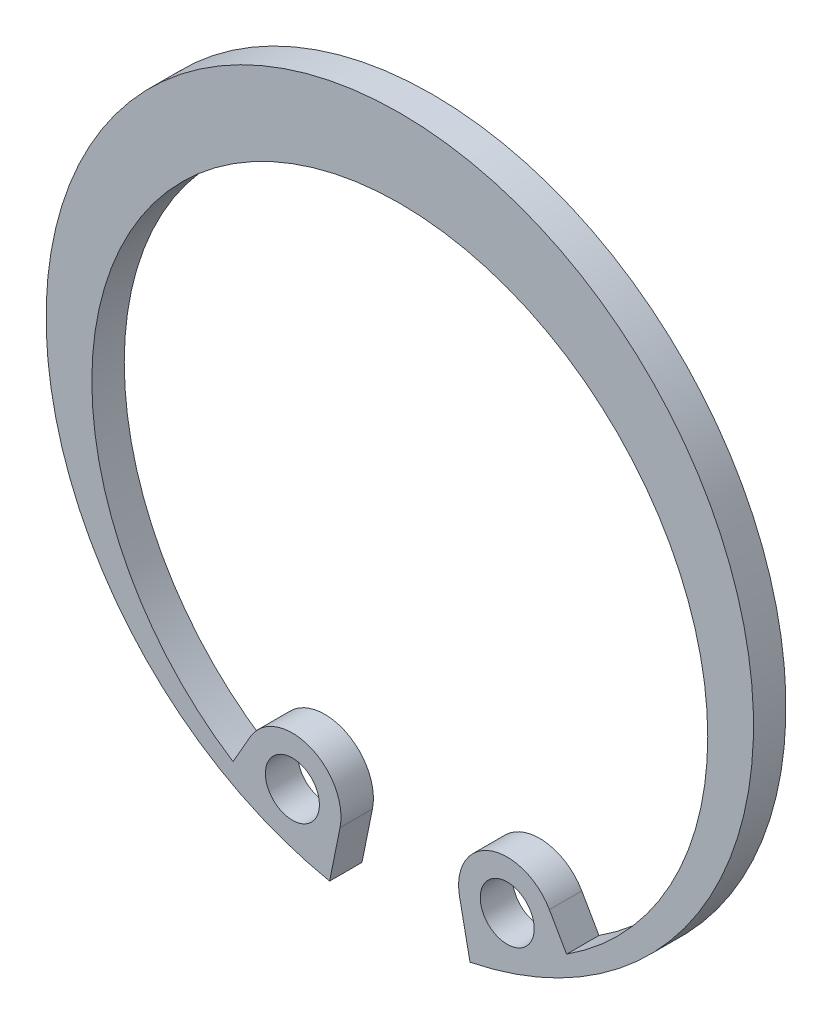
ISO-10303-21;
HEADER;
FILE_DESCRIPTION(('STEP AP214'),'2;1');
FILE_NAME('part.step','',(''),(''),'','','');
FILE_SCHEMA(('AUTOMOTIVE_DESIGN { 1 0 10303 214 1 1 1 1 }'));
ENDSEC;
DATA;
#1=APPLICATION_CONTEXT('core data for automotive mechanical design processes');
#2=APPLICATION_PROTOCOL_DEFINITION('international standard','automotive_design',2000,#1);
#3=PRODUCT_CONTEXT('',#1,'mechanical');
#4=PRODUCT('Part','Part','',(#3));
#5=PRODUCT_RELATED_PRODUCT_CATEGORY('part','',(#4));
#6=PRODUCT_DEFINITION_FORMATION('','',#4);
#7=PRODUCT_DEFINITION_CONTEXT('part definition',#1,'design');
#8=PRODUCT_DEFINITION('design','',#6,#7);
#9=PRODUCT_DEFINITION_SHAPE('','',#8);
#10=(LENGTH_UNIT() NAMED_UNIT(*) SI_UNIT(.MILLI.,.METRE.));
#11=(NAMED_UNIT(*) PLANE_ANGLE_UNIT() SI_UNIT($,.RADIAN.));
#12=(NAMED_UNIT(*) SI_UNIT($,.STERADIAN.) SOLID_ANGLE_UNIT());
#13=UNCERTAINTY_MEASURE_WITH_UNIT(LENGTH_MEASURE(1.E-05),#10,'distance_accuracy_value','');
#14=(GEOMETRIC_REPRESENTATION_CONTEXT(3) GLOBAL_UNCERTAINTY_ASSIGNED_CONTEXT((#13)) GLOBAL_UNIT_ASSIGNED_CONTEXT((#10,
#11,#12)) REPRESENTATION_CONTEXT('',''));
#15=CARTESIAN_POINT('',(0.,0.,0.));
#16=DIRECTION('',(0.,0.,1.));
#17=DIRECTION('',(1.,0.,0.));
#18=AXIS2_PLACEMENT_3D('',#15,#16,#17);
#19=CARTESIAN_POINT('',(0.,-1.20555555555556,1.2));
#20=DIRECTION('',(0.,0.,1.));
#21=DIRECTION('',(1.,0.,0.));
#22=AXIS2_PLACEMENT_3D('',#19,#20,#21);
#23=PLANE('',#22);
#24=CARTESIAN_POINT('',(-3.97830291432374,-10.5765356294906,1.2));
#25=DIRECTION('',(0.,0.,-1.));
#26=DIRECTION('',(-1.,0.,0.));
#27=AXIS2_PLACEMENT_3D('',#24,#25,#26);
#28=CIRCLE('',#27,1.);
#29=CARTESIAN_POINT('',(-4.97830291432374,-10.5765356294906,1.2));
#30=VERTEX_POINT('',#29);
#31=EDGE_CURVE('E259',#30,#30,#28,.T.);
#32=ORIENTED_EDGE('',*,*,#31,.T.);
#33=EDGE_LOOP('',(#32));
#34=FACE_BOUND('',#33,.T.);
#35=CARTESIAN_POINT('',(0.,-1.20555555555556,1.2));
#36=DIRECTION('',(0.,0.,1.));
#37=DIRECTION('',(1.,0.,0.));
#38=AXIS2_PLACEMENT_3D('',#35,#36,#37);
#39=CIRCLE('',#38,11.4055555555556);
#40=CARTESIAN_POINT('',(6.1765617534573,-10.7939225925746,1.2));
#41=VERTEX_POINT('',#40);
#42=CARTESIAN_POINT('',(-6.1765617534573,-10.7939225925746,1.2));
#43=VERTEX_POINT('',#42);
#44=EDGE_CURVE('E93',#41,#43,#39,.T.);
#45=ORIENTED_EDGE('',*,*,#44,.F.);
#46=DIRECTION('',(-0.496660519236277,0.867944888015335,0.));
#47=VECTOR('',#46,1.);
#48=CARTESIAN_POINT('',(6.1765617534573,-10.7939225925746,1.2));
#49=LINE('',#48,#47);
#50=CARTESIAN_POINT('',(5.54060371275134,-9.68254669486525,1.2));
#51=VERTEX_POINT('',#50);
#52=EDGE_CURVE('E48',#41,#51,#49,.T.);
#53=ORIENTED_EDGE('',*,*,#52,.T.);
#54=CARTESIAN_POINT('',(3.97830291432374,-10.5765356294906,1.2));
#55=DIRECTION('',(0.,0.,-1.));
#56=DIRECTION('',(-1.,0.,0.));
#57=AXIS2_PLACEMENT_3D('',#54,#55,#56);
#58=CIRCLE('',#57,1.8);
#59=CARTESIAN_POINT('',(2.21411157721012,-10.9337875378875,1.2));
#60=VERTEX_POINT('',#59);
#61=EDGE_CURVE('E144',#60,#51,#58,.T.);
#62=ORIENTED_EDGE('',*,*,#61,.F.);
#63=DIRECTION('',(0.198473282442748,-0.980106298396455,0.));
#64=VECTOR('',#63,1.);
#65=CARTESIAN_POINT('',(2.21411157721012,-10.9337875378875,1.2));
#66=LINE('',#65,#64);
#67=CARTESIAN_POINT('',(2.6,-12.8393925089936,1.2));
#68=VERTEX_POINT('',#67);
#69=EDGE_CURVE('E142',#60,#68,#66,.T.);
#70=ORIENTED_EDGE('',*,*,#69,.T.);
#71=CARTESIAN_POINT('',(0.,0.,1.2));
#72=DIRECTION('',(0.,0.,1.));
#73=DIRECTION('',(1.,0.,0.));
#74=AXIS2_PLACEMENT_3D('',#71,#72,#73);
#75=CIRCLE('',#74,13.1);
#76=CARTESIAN_POINT('',(-2.60000000000001,-12.8393925089936,1.2));
#77=VERTEX_POINT('',#76);
#78=EDGE_CURVE('E140',#68,#77,#75,.T.);
#79=ORIENTED_EDGE('',*,*,#78,.T.);
#80=DIRECTION('',(-0.198473282442748,-0.980106298396455,0.));
#81=VECTOR('',#80,1.);
#82=CARTESIAN_POINT('',(-2.21411157721012,-10.9337875378875,1.2));
#83=LINE('',#82,#81);
#84=CARTESIAN_POINT('',(-2.21411157721012,-10.9337875378875,1.2));
#85=VERTEX_POINT('',#84);
#86=EDGE_CURVE('E137',#85,#77,#83,.T.);
#87=ORIENTED_EDGE('',*,*,#86,.F.);
#88=CARTESIAN_POINT('',(-3.97830291432374,-10.5765356294906,1.2));
#89=DIRECTION('',(0.,0.,1.));
#90=DIRECTION('',(1.,0.,0.));
#91=AXIS2_PLACEMENT_3D('',#88,#89,#90);
#92=CIRCLE('',#91,1.8);
#93=CARTESIAN_POINT('',(-5.54060371275134,-9.68254669486526,1.2));
#94=VERTEX_POINT('',#93);
#95=EDGE_CURVE('E135',#85,#94,#92,.T.);
#96=ORIENTED_EDGE('',*,*,#95,.T.);
#97=DIRECTION('',(0.496660519236278,0.867944888015334,0.));
#98=VECTOR('',#97,1.);
#99=CARTESIAN_POINT('',(-6.1765617534573,-10.7939225925746,1.2));
#100=LINE('',#99,#98);
#101=EDGE_CURVE('E133',#43,#94,#100,.T.);
#102=ORIENTED_EDGE('',*,*,#101,.F.);
#103=EDGE_LOOP('',(#45,#53,#62,#70,#79,#87,#96,#102));
#104=FACE_BOUND('',#103,.T.);
#105=CARTESIAN_POINT('',(3.97830291432374,-10.5765356294906,1.2));
#106=DIRECTION('',(0.,0.,1.));
#107=DIRECTION('',(1.,0.,0.));
#108=AXIS2_PLACEMENT_3D('',#105,#106,#107);
#109=CIRCLE('',#108,1.);
#110=CARTESIAN_POINT('',(4.97830291432374,-10.5765356294906,1.2));
#111=VERTEX_POINT('',#110);
#112=EDGE_CURVE('E113',#111,#111,#109,.T.);
#113=ORIENTED_EDGE('',*,*,#112,.F.);
#114=EDGE_LOOP('',(#113));
#115=FACE_BOUND('',#114,.T.);
#116=ADVANCED_FACE('F26',(#34,#104,#115),#23,.T.);
#117=CARTESIAN_POINT('',(0.,-1.20555555555556,0.));
#118=DIRECTION('',(0.,0.,1.));
#119=DIRECTION('',(1.,0.,0.));
#120=AXIS2_PLACEMENT_3D('',#117,#118,#119);
#121=PLANE('',#120);
#122=CARTESIAN_POINT('',(-3.97830291432374,-10.5765356294906,0.));
#123=DIRECTION('',(0.,0.,-1.));
#124=DIRECTION('',(-1.,0.,0.));
#125=AXIS2_PLACEMENT_3D('',#122,#123,#124);
#126=CIRCLE('',#125,1.);
#127=CARTESIAN_POINT('',(-4.97830291432374,-10.5765356294906,0.));
#128=VERTEX_POINT('',#127);
#129=EDGE_CURVE('E262',#128,#128,#126,.T.);
#130=ORIENTED_EDGE('',*,*,#129,.F.);
#131=EDGE_LOOP('',(#130));
#132=FACE_BOUND('',#131,.T.);
#133=CARTESIAN_POINT('',(0.,-1.20555555555556,0.));
#134=DIRECTION('',(0.,0.,1.));
#135=DIRECTION('',(1.,0.,0.));
#136=AXIS2_PLACEMENT_3D('',#133,#134,#135);
#137=CIRCLE('',#136,11.4055555555556);
#138=CARTESIAN_POINT('',(6.1765617534573,-10.7939225925746,0.));
#139=VERTEX_POINT('',#138);
#140=CARTESIAN_POINT('',(-6.1765617534573,-10.7939225925746,0.));
#141=VERTEX_POINT('',#140);
#142=EDGE_CURVE('E92',#139,#141,#137,.T.);
#143=ORIENTED_EDGE('',*,*,#142,.T.);
#144=DIRECTION('',(0.496660519236278,0.867944888015334,0.));
#145=VECTOR('',#144,1.);
#146=CARTESIAN_POINT('',(-6.1765617534573,-10.7939225925746,0.));
#147=LINE('',#146,#145);
#148=CARTESIAN_POINT('',(-5.54060371275134,-9.68254669486526,0.));
#149=VERTEX_POINT('',#148);
#150=EDGE_CURVE('E99',#141,#149,#147,.T.);
#151=ORIENTED_EDGE('',*,*,#150,.T.);
#152=CARTESIAN_POINT('',(-3.97830291432374,-10.5765356294906,0.));
#153=DIRECTION('',(0.,0.,1.));
#154=DIRECTION('',(1.,0.,0.));
#155=AXIS2_PLACEMENT_3D('',#152,#153,#154);
#156=CIRCLE('',#155,1.8);
#157=CARTESIAN_POINT('',(-2.21411157721012,-10.9337875378875,0.));
#158=VERTEX_POINT('',#157);
#159=EDGE_CURVE('E105',#158,#149,#156,.T.);
#160=ORIENTED_EDGE('',*,*,#159,.F.);
#161=DIRECTION('',(-0.198473282442748,-0.980106298396455,0.));
#162=VECTOR('',#161,1.);
#163=CARTESIAN_POINT('',(-2.21411157721012,-10.9337875378875,0.));
#164=LINE('',#163,#162);
#165=CARTESIAN_POINT('',(-2.60000000000001,-12.8393925089936,0.));
#166=VERTEX_POINT('',#165);
#167=EDGE_CURVE('E121',#158,#166,#164,.T.);
#168=ORIENTED_EDGE('',*,*,#167,.T.);
#169=CARTESIAN_POINT('',(0.,0.,0.));
#170=DIRECTION('',(0.,0.,1.));
#171=DIRECTION('',(1.,0.,0.));
#172=AXIS2_PLACEMENT_3D('',#169,#170,#171);
#173=CIRCLE('',#172,13.1);
#174=CARTESIAN_POINT('',(2.6,-12.8393925089936,0.));
#175=VERTEX_POINT('',#174);
#176=EDGE_CURVE('E124',#175,#166,#173,.T.);
#177=ORIENTED_EDGE('',*,*,#176,.F.);
#178=DIRECTION('',(0.198473282442748,-0.980106298396455,0.));
#179=VECTOR('',#178,1.);
#180=CARTESIAN_POINT('',(2.21411157721012,-10.9337875378875,0.));
#181=LINE('',#180,#179);
#182=CARTESIAN_POINT('',(2.21411157721012,-10.9337875378875,0.));
#183=VERTEX_POINT('',#182);
#184=EDGE_CURVE('E127',#183,#175,#181,.T.);
#185=ORIENTED_EDGE('',*,*,#184,.F.);
#186=CARTESIAN_POINT('',(3.97830291432374,-10.5765356294906,0.));
#187=DIRECTION('',(0.,0.,-1.));
#188=DIRECTION('',(-1.,0.,0.));
#189=AXIS2_PLACEMENT_3D('',#186,#187,#188);
#190=CIRCLE('',#189,1.8);
#191=CARTESIAN_POINT('',(5.54060371275134,-9.68254669486525,0.));
#192=VERTEX_POINT('',#191);
#193=EDGE_CURVE('E129',#183,#192,#190,.T.);
#194=ORIENTED_EDGE('',*,*,#193,.T.);
#195=DIRECTION('',(-0.496660519236277,0.867944888015335,0.));
#196=VECTOR('',#195,1.);
#197=CARTESIAN_POINT('',(6.1765617534573,-10.7939225925746,0.));
#198=LINE('',#197,#196);
#199=EDGE_CURVE('E112',#139,#192,#198,.T.);
#200=ORIENTED_EDGE('',*,*,#199,.F.);
#201=EDGE_LOOP('',(#143,#151,#160,#168,#177,#185,#194,#200));
#202=FACE_BOUND('',#201,.T.);
#203=CARTESIAN_POINT('',(3.97830291432374,-10.5765356294906,0.));
#204=DIRECTION('',(0.,0.,1.));
#205=DIRECTION('',(1.,0.,0.));
#206=AXIS2_PLACEMENT_3D('',#203,#204,#205);
#207=CIRCLE('',#206,1.);
#208=CARTESIAN_POINT('',(4.97830291432374,-10.5765356294906,0.));
#209=VERTEX_POINT('',#208);
#210=EDGE_CURVE('E116',#209,#209,#207,.T.);
#211=ORIENTED_EDGE('',*,*,#210,.T.);
#212=EDGE_LOOP('',(#211));
#213=FACE_BOUND('',#212,.T.);
#214=ADVANCED_FACE('F108',(#132,#202,#213),#121,.F.);
#215=CARTESIAN_POINT('',(0.,-1.20555555555556,1.2));
#216=DIRECTION('',(0.,0.,-1.));
#217=DIRECTION('',(-1.,0.,0.));
#218=AXIS2_PLACEMENT_3D('',#215,#216,#217);
#219=CYLINDRICAL_SURFACE('',#218,11.4055555555556);
#220=ORIENTED_EDGE('',*,*,#142,.F.);
#221=DIRECTION('',(0.,0.,-1.));
#222=VECTOR('',#221,1.);
#223=CARTESIAN_POINT('',(6.1765617534573,-10.7939225925746,1.2));
#224=LINE('',#223,#222);
#225=EDGE_CURVE('E11',#41,#139,#224,.T.);
#226=ORIENTED_EDGE('',*,*,#225,.F.);
#227=ORIENTED_EDGE('',*,*,#44,.T.);
#228=DIRECTION('',(0.,0.,-1.));
#229=VECTOR('',#228,1.);
#230=CARTESIAN_POINT('',(-6.1765617534573,-10.7939225925746,1.2));
#231=LINE('',#230,#229);
#232=EDGE_CURVE('E30',#43,#141,#231,.T.);
#233=ORIENTED_EDGE('',*,*,#232,.T.);
#234=EDGE_LOOP('',(#220,#226,#227,#233));
#235=FACE_BOUND('',#234,.T.);
#236=ADVANCED_FACE('F28',(#235),#219,.F.);
#237=CARTESIAN_POINT('',(6.1765617534573,-10.7939225925746,1.2));
#238=DIRECTION('',(-0.867944888015335,-0.496660519236277,0.));
#239=DIRECTION('',(0.496660519236277,-0.867944888015335,0.));
#240=AXIS2_PLACEMENT_3D('',#237,#238,#239);
#241=PLANE('',#240);
#242=ORIENTED_EDGE('',*,*,#199,.T.);
#243=DIRECTION('',(0.,0.,-1.));
#244=VECTOR('',#243,1.);
#245=CARTESIAN_POINT('',(5.54060371275134,-9.68254669486525,1.2));
#246=LINE('',#245,#244);
#247=EDGE_CURVE('E35',#51,#192,#246,.T.);
#248=ORIENTED_EDGE('',*,*,#247,.F.);
#249=ORIENTED_EDGE('',*,*,#52,.F.);
#250=ORIENTED_EDGE('',*,*,#225,.T.);
#251=EDGE_LOOP('',(#242,#248,#249,#250));
#252=FACE_BOUND('',#251,.T.);
#253=ADVANCED_FACE('F177',(#252),#241,.F.);
#254=CARTESIAN_POINT('',(3.97830291432374,-10.5765356294906,1.2));
#255=DIRECTION('',(0.,0.,-1.));
#256=DIRECTION('',(-1.,0.,0.));
#257=AXIS2_PLACEMENT_3D('',#254,#255,#256);
#258=CYLINDRICAL_SURFACE('',#257,1.8);
#259=ORIENTED_EDGE('',*,*,#193,.F.);
#260=DIRECTION('',(0.,0.,-1.));
#261=VECTOR('',#260,1.);
#262=CARTESIAN_POINT('',(2.21411157721012,-10.9337875378875,1.2));
#263=LINE('',#262,#261);
#264=EDGE_CURVE('E149',#60,#183,#263,.T.);
#265=ORIENTED_EDGE('',*,*,#264,.F.);
#266=ORIENTED_EDGE('',*,*,#61,.T.);
#267=ORIENTED_EDGE('',*,*,#247,.T.);
#268=EDGE_LOOP('',(#259,#265,#266,#267));
#269=FACE_BOUND('',#268,.T.);
#270=ADVANCED_FACE('F174',(#269),#258,.T.);
#271=CARTESIAN_POINT('',(2.21411157721012,-10.9337875378875,1.2));
#272=DIRECTION('',(0.980106298396455,0.198473282442748,0.));
#273=DIRECTION('',(-0.198473282442748,0.980106298396455,0.));
#274=AXIS2_PLACEMENT_3D('',#271,#272,#273);
#275=PLANE('',#274);
#276=ORIENTED_EDGE('',*,*,#184,.T.);
#277=DIRECTION('',(0.,0.,-1.));
#278=VECTOR('',#277,1.);
#279=CARTESIAN_POINT('',(2.6,-12.8393925089936,1.2));
#280=LINE('',#279,#278);
#281=EDGE_CURVE('E151',#68,#175,#280,.T.);
#282=ORIENTED_EDGE('',*,*,#281,.F.);
#283=ORIENTED_EDGE('',*,*,#69,.F.);
#284=ORIENTED_EDGE('',*,*,#264,.T.);
#285=EDGE_LOOP('',(#276,#282,#283,#284));
#286=FACE_BOUND('',#285,.T.);
#287=ADVANCED_FACE('F179',(#286),#275,.F.);
#288=CARTESIAN_POINT('',(0.,0.,1.2));
#289=DIRECTION('',(0.,0.,-1.));
#290=DIRECTION('',(-1.,0.,0.));
#291=AXIS2_PLACEMENT_3D('',#288,#289,#290);
#292=CYLINDRICAL_SURFACE('',#291,13.1);
#293=ORIENTED_EDGE('',*,*,#176,.T.);
#294=DIRECTION('',(0.,0.,-1.));
#295=VECTOR('',#294,1.);
#296=CARTESIAN_POINT('',(-2.60000000000001,-12.8393925089936,1.2));
#297=LINE('',#296,#295);
#298=EDGE_CURVE('E154',#77,#166,#297,.T.);
#299=ORIENTED_EDGE('',*,*,#298,.F.);
#300=ORIENTED_EDGE('',*,*,#78,.F.);
#301=ORIENTED_EDGE('',*,*,#281,.T.);
#302=EDGE_LOOP('',(#293,#299,#300,#301));
#303=FACE_BOUND('',#302,.T.);
#304=ADVANCED_FACE('F168',(#303),#292,.T.);
#305=CARTESIAN_POINT('',(-2.21411157721012,-10.9337875378875,1.2));
#306=DIRECTION('',(0.980106298396455,-0.198473282442748,0.));
#307=DIRECTION('',(0.198473282442748,0.980106298396455,0.));
#308=AXIS2_PLACEMENT_3D('',#305,#306,#307);
#309=PLANE('',#308);
#310=ORIENTED_EDGE('',*,*,#167,.F.);
#311=DIRECTION('',(0.,0.,-1.));
#312=VECTOR('',#311,1.);
#313=CARTESIAN_POINT('',(-2.21411157721012,-10.9337875378875,1.2));
#314=LINE('',#313,#312);
#315=EDGE_CURVE('E156',#85,#158,#314,.T.);
#316=ORIENTED_EDGE('',*,*,#315,.F.);
#317=ORIENTED_EDGE('',*,*,#86,.T.);
#318=ORIENTED_EDGE('',*,*,#298,.T.);
#319=EDGE_LOOP('',(#310,#316,#317,#318));
#320=FACE_BOUND('',#319,.T.);
#321=ADVANCED_FACE('F164',(#320),#309,.T.);
#322=CARTESIAN_POINT('',(-3.97830291432374,-10.5765356294906,1.2));
#323=DIRECTION('',(0.,0.,-1.));
#324=DIRECTION('',(-1.,0.,0.));
#325=AXIS2_PLACEMENT_3D('',#322,#323,#324);
#326=CYLINDRICAL_SURFACE('',#325,1.8);
#327=ORIENTED_EDGE('',*,*,#159,.T.);
#328=DIRECTION('',(0.,0.,-1.));
#329=VECTOR('',#328,1.);
#330=CARTESIAN_POINT('',(-5.54060371275134,-9.68254669486526,1.2));
#331=LINE('',#330,#329);
#332=EDGE_CURVE('E97',#94,#149,#331,.T.);
#333=ORIENTED_EDGE('',*,*,#332,.F.);
#334=ORIENTED_EDGE('',*,*,#95,.F.);
#335=ORIENTED_EDGE('',*,*,#315,.T.);
#336=EDGE_LOOP('',(#327,#333,#334,#335));
#337=FACE_BOUND('',#336,.T.);
#338=ADVANCED_FACE('F159',(#337),#326,.T.);
#339=CARTESIAN_POINT('',(-6.1765617534573,-10.7939225925746,1.2));
#340=DIRECTION('',(-0.867944888015334,0.496660519236278,0.));
#341=DIRECTION('',(-0.496660519236279,-0.867944888015334,0.));
#342=AXIS2_PLACEMENT_3D('',#339,#340,#341);
#343=PLANE('',#342);
#344=ORIENTED_EDGE('',*,*,#150,.F.);
#345=ORIENTED_EDGE('',*,*,#232,.F.);
#346=ORIENTED_EDGE('',*,*,#101,.T.);
#347=ORIENTED_EDGE('',*,*,#332,.T.);
#348=EDGE_LOOP('',(#344,#345,#346,#347));
#349=FACE_BOUND('',#348,.T.);
#350=ADVANCED_FACE('F100',(#349),#343,.T.);
#351=CARTESIAN_POINT('',(3.97830291432374,-10.5765356294906,1.2));
#352=DIRECTION('',(0.,0.,-1.));
#353=DIRECTION('',(-1.,0.,0.));
#354=AXIS2_PLACEMENT_3D('',#351,#352,#353);
#355=CYLINDRICAL_SURFACE('',#354,1.);
#356=ORIENTED_EDGE('',*,*,#112,.T.);
#357=EDGE_LOOP('',(#356));
#358=FACE_BOUND('',#357,.T.);
#359=ORIENTED_EDGE('',*,*,#210,.F.);
#360=EDGE_LOOP('',(#359));
#361=FACE_BOUND('',#360,.T.);
#362=ADVANCED_FACE('F242',(#358,#361),#355,.F.);
#363=CARTESIAN_POINT('',(-3.97830291432374,-10.5765356294906,1.2));
#364=DIRECTION('',(0.,0.,-1.));
#365=DIRECTION('',(-1.,0.,0.));
#366=AXIS2_PLACEMENT_3D('',#363,#364,#365);
#367=CYLINDRICAL_SURFACE('',#366,1.);
#368=ORIENTED_EDGE('',*,*,#31,.F.);
#369=EDGE_LOOP('',(#368));
#370=FACE_BOUND('',#369,.T.);
#371=ORIENTED_EDGE('',*,*,#129,.T.);
#372=EDGE_LOOP('',(#371));
#373=FACE_BOUND('',#372,.T.);
#374=ADVANCED_FACE('F248',(#370,#373),#367,.F.);
#375=CLOSED_SHELL('',(#116,#214,#236,#253,#270,#287,#304,#321,#338,#350,#362,#374));
#376=MANIFOLD_SOLID_BREP('B2',#375);
#377=ADVANCED_BREP_SHAPE_REPRESENTATION('',(#18,#376),#14);
#378=SHAPE_DEFINITION_REPRESENTATION(#9,#377);
ENDSEC;
END-ISO-10303-21;
